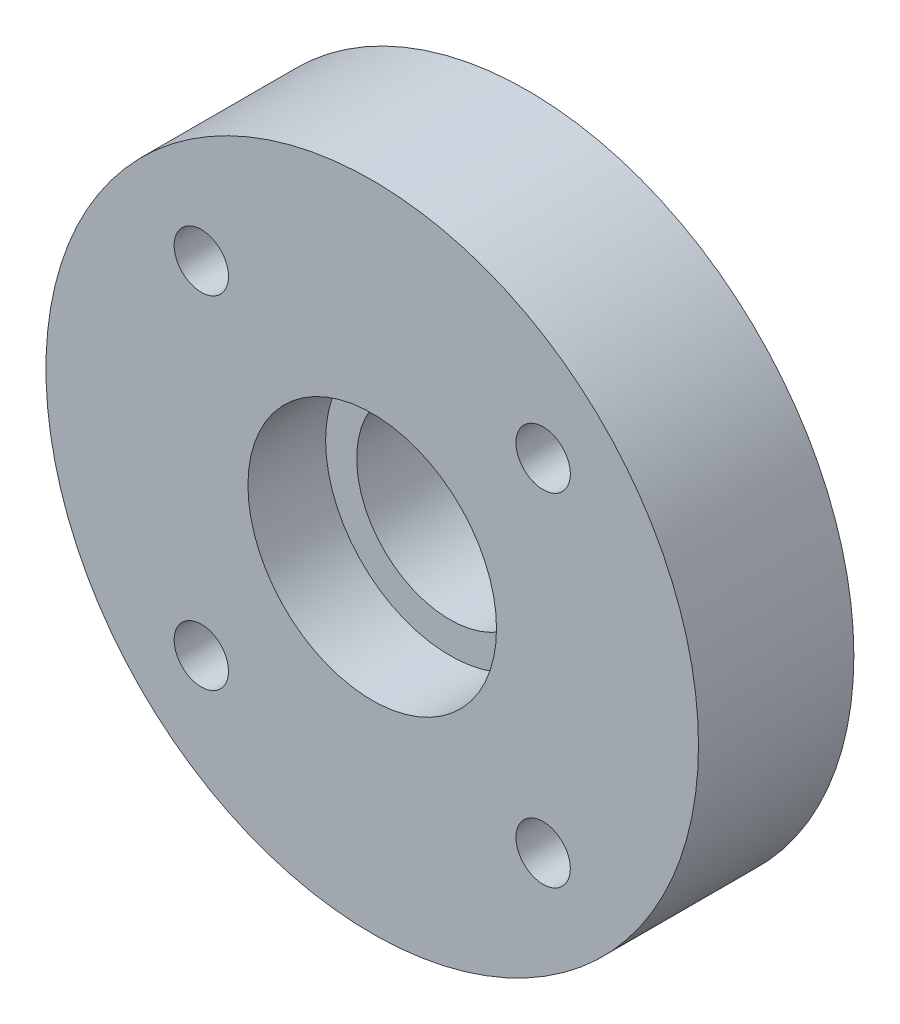
ISO-10303-21;
HEADER;
FILE_DESCRIPTION(('STEP AP214'),'2;1');
FILE_NAME('part.step','',(''),(''),'','','');
FILE_SCHEMA(('AUTOMOTIVE_DESIGN { 1 0 10303 214 1 1 1 1 }'));
ENDSEC;
DATA;
#1=APPLICATION_CONTEXT('core data for automotive mechanical design processes');
#2=APPLICATION_PROTOCOL_DEFINITION('international standard','automotive_design',2000,#1);
#3=PRODUCT_CONTEXT('',#1,'mechanical');
#4=PRODUCT('Part','Part','',(#3));
#5=PRODUCT_RELATED_PRODUCT_CATEGORY('part','',(#4));
#6=PRODUCT_DEFINITION_FORMATION('','',#4);
#7=PRODUCT_DEFINITION_CONTEXT('part definition',#1,'design');
#8=PRODUCT_DEFINITION('design','',#6,#7);
#9=PRODUCT_DEFINITION_SHAPE('','',#8);
#10=(LENGTH_UNIT() NAMED_UNIT(*) SI_UNIT(.MILLI.,.METRE.));
#11=(NAMED_UNIT(*) PLANE_ANGLE_UNIT() SI_UNIT($,.RADIAN.));
#12=(NAMED_UNIT(*) SI_UNIT($,.STERADIAN.) SOLID_ANGLE_UNIT());
#13=UNCERTAINTY_MEASURE_WITH_UNIT(LENGTH_MEASURE(1.E-05),#10,'distance_accuracy_value','');
#14=(GEOMETRIC_REPRESENTATION_CONTEXT(3) GLOBAL_UNCERTAINTY_ASSIGNED_CONTEXT((#13)) GLOBAL_UNIT_ASSIGNED_CONTEXT((#10,
#11,#12)) REPRESENTATION_CONTEXT('',''));
#15=CARTESIAN_POINT('',(0.,0.,0.));
#16=DIRECTION('',(0.,0.,1.));
#17=DIRECTION('',(1.,0.,0.));
#18=AXIS2_PLACEMENT_3D('',#15,#16,#17);
#19=CARTESIAN_POINT('',(0.,0.,0.));
#20=DIRECTION('',(0.,0.,1.));
#21=DIRECTION('',(1.,0.,0.));
#22=AXIS2_PLACEMENT_3D('',#19,#20,#21);
#23=CYLINDRICAL_SURFACE('',#22,6.);
#24=CARTESIAN_POINT('',(0.,0.,0.));
#25=DIRECTION('',(0.,0.,1.));
#26=DIRECTION('',(1.,0.,0.));
#27=AXIS2_PLACEMENT_3D('',#24,#25,#26);
#28=CIRCLE('',#27,6.);
#29=CARTESIAN_POINT('',(6.,0.,0.));
#30=VERTEX_POINT('',#29);
#31=EDGE_CURVE('E44',#30,#30,#28,.T.);
#32=ORIENTED_EDGE('',*,*,#31,.F.);
#33=EDGE_LOOP('',(#32));
#34=FACE_BOUND('',#33,.T.);
#35=CARTESIAN_POINT('',(0.,0.,5.));
#36=DIRECTION('',(0.,0.,1.));
#37=DIRECTION('',(1.,0.,0.));
#38=AXIS2_PLACEMENT_3D('',#35,#36,#37);
#39=CIRCLE('',#38,6.);
#40=CARTESIAN_POINT('',(6.,0.,5.));
#41=VERTEX_POINT('',#40);
#42=EDGE_CURVE('E35',#41,#41,#39,.F.);
#43=ORIENTED_EDGE('',*,*,#42,.F.);
#44=EDGE_LOOP('',(#43));
#45=FACE_BOUND('',#44,.T.);
#46=ADVANCED_FACE('F31',(#34,#45),#23,.F.);
#47=CARTESIAN_POINT('',(0.,0.,10.));
#48=DIRECTION('',(0.,0.,-1.));
#49=DIRECTION('',(-1.,0.,0.));
#50=AXIS2_PLACEMENT_3D('',#47,#48,#49);
#51=CYLINDRICAL_SURFACE('',#50,21.);
#52=CARTESIAN_POINT('',(0.,0.,10.));
#53=DIRECTION('',(0.,0.,1.));
#54=DIRECTION('',(1.,0.,0.));
#55=AXIS2_PLACEMENT_3D('',#52,#53,#54);
#56=CIRCLE('',#55,21.);
#57=CARTESIAN_POINT('',(21.,0.,10.));
#58=VERTEX_POINT('',#57);
#59=EDGE_CURVE('E10',#58,#58,#56,.T.);
#60=ORIENTED_EDGE('',*,*,#59,.F.);
#61=EDGE_LOOP('',(#60));
#62=FACE_BOUND('',#61,.T.);
#63=CARTESIAN_POINT('',(0.,0.,0.));
#64=DIRECTION('',(0.,0.,1.));
#65=DIRECTION('',(1.,0.,0.));
#66=AXIS2_PLACEMENT_3D('',#63,#64,#65);
#67=CIRCLE('',#66,21.);
#68=CARTESIAN_POINT('',(21.,0.,0.));
#69=VERTEX_POINT('',#68);
#70=EDGE_CURVE('E39',#69,#69,#67,.T.);
#71=ORIENTED_EDGE('',*,*,#70,.T.);
#72=EDGE_LOOP('',(#71));
#73=FACE_BOUND('',#72,.T.);
#74=ADVANCED_FACE('F33',(#62,#73),#51,.T.);
#75=CARTESIAN_POINT('',(0.,0.,10.));
#76=DIRECTION('',(0.,0.,1.));
#77=DIRECTION('',(1.,0.,0.));
#78=AXIS2_PLACEMENT_3D('',#75,#76,#77);
#79=PLANE('',#78);
#80=CARTESIAN_POINT('',(-11.,-11.,10.));
#81=DIRECTION('',(0.,0.,1.));
#82=DIRECTION('',(-1.,0.,0.));
#83=AXIS2_PLACEMENT_3D('',#80,#81,#82);
#84=CIRCLE('',#83,1.75);
#85=CARTESIAN_POINT('',(-12.75,-11.,10.));
#86=VERTEX_POINT('',#85);
#87=EDGE_CURVE('E73',#86,#86,#84,.T.);
#88=ORIENTED_EDGE('',*,*,#87,.F.);
#89=EDGE_LOOP('',(#88));
#90=FACE_BOUND('',#89,.T.);
#91=CARTESIAN_POINT('',(11.,-11.,10.));
#92=DIRECTION('',(0.,0.,1.));
#93=DIRECTION('',(1.,0.,0.));
#94=AXIS2_PLACEMENT_3D('',#91,#92,#93);
#95=CIRCLE('',#94,1.75);
#96=CARTESIAN_POINT('',(12.75,-11.,10.));
#97=VERTEX_POINT('',#96);
#98=EDGE_CURVE('E67',#97,#97,#95,.T.);
#99=ORIENTED_EDGE('',*,*,#98,.F.);
#100=EDGE_LOOP('',(#99));
#101=FACE_BOUND('',#100,.T.);
#102=CARTESIAN_POINT('',(11.,11.,10.));
#103=DIRECTION('',(0.,0.,1.));
#104=DIRECTION('',(-1.,0.,0.));
#105=AXIS2_PLACEMENT_3D('',#102,#103,#104);
#106=CIRCLE('',#105,1.75);
#107=CARTESIAN_POINT('',(9.25,11.,10.));
#108=VERTEX_POINT('',#107);
#109=EDGE_CURVE('E61',#108,#108,#106,.T.);
#110=ORIENTED_EDGE('',*,*,#109,.F.);
#111=EDGE_LOOP('',(#110));
#112=FACE_BOUND('',#111,.T.);
#113=CARTESIAN_POINT('',(-11.,11.,10.));
#114=DIRECTION('',(0.,0.,1.));
#115=DIRECTION('',(1.,0.,0.));
#116=AXIS2_PLACEMENT_3D('',#113,#114,#115);
#117=CIRCLE('',#116,1.75);
#118=CARTESIAN_POINT('',(-9.25,11.,10.));
#119=VERTEX_POINT('',#118);
#120=EDGE_CURVE('E55',#119,#119,#117,.T.);
#121=ORIENTED_EDGE('',*,*,#120,.F.);
#122=EDGE_LOOP('',(#121));
#123=FACE_BOUND('',#122,.T.);
#124=CARTESIAN_POINT('',(0.,0.,10.));
#125=DIRECTION('',(0.,0.,1.));
#126=DIRECTION('',(1.,0.,0.));
#127=AXIS2_PLACEMENT_3D('',#124,#125,#126);
#128=CIRCLE('',#127,8.);
#129=CARTESIAN_POINT('',(8.,0.,10.));
#130=VERTEX_POINT('',#129);
#131=EDGE_CURVE('E48',#130,#130,#128,.T.);
#132=ORIENTED_EDGE('',*,*,#131,.F.);
#133=EDGE_LOOP('',(#132));
#134=FACE_BOUND('',#133,.T.);
#135=ORIENTED_EDGE('',*,*,#59,.T.);
#136=EDGE_LOOP('',(#135));
#137=FACE_BOUND('',#136,.T.);
#138=ADVANCED_FACE('F89',(#90,#101,#112,#123,#134,#137),#79,.T.);
#139=CARTESIAN_POINT('',(0.,0.,0.));
#140=DIRECTION('',(0.,0.,1.));
#141=DIRECTION('',(1.,0.,0.));
#142=AXIS2_PLACEMENT_3D('',#139,#140,#141);
#143=PLANE('',#142);
#144=CARTESIAN_POINT('',(-11.,-11.,0.));
#145=DIRECTION('',(0.,0.,1.));
#146=DIRECTION('',(-1.,0.,0.));
#147=AXIS2_PLACEMENT_3D('',#144,#145,#146);
#148=CIRCLE('',#147,1.75);
#149=CARTESIAN_POINT('',(-12.75,-11.,0.));
#150=VERTEX_POINT('',#149);
#151=EDGE_CURVE('E70',#150,#150,#148,.T.);
#152=ORIENTED_EDGE('',*,*,#151,.T.);
#153=EDGE_LOOP('',(#152));
#154=FACE_BOUND('',#153,.T.);
#155=CARTESIAN_POINT('',(11.,-11.,0.));
#156=DIRECTION('',(0.,0.,1.));
#157=DIRECTION('',(1.,0.,0.));
#158=AXIS2_PLACEMENT_3D('',#155,#156,#157);
#159=CIRCLE('',#158,1.75);
#160=CARTESIAN_POINT('',(12.75,-11.,0.));
#161=VERTEX_POINT('',#160);
#162=EDGE_CURVE('E64',#161,#161,#159,.T.);
#163=ORIENTED_EDGE('',*,*,#162,.T.);
#164=EDGE_LOOP('',(#163));
#165=FACE_BOUND('',#164,.T.);
#166=CARTESIAN_POINT('',(11.,11.,0.));
#167=DIRECTION('',(0.,0.,1.));
#168=DIRECTION('',(-1.,0.,0.));
#169=AXIS2_PLACEMENT_3D('',#166,#167,#168);
#170=CIRCLE('',#169,1.75);
#171=CARTESIAN_POINT('',(9.25,11.,0.));
#172=VERTEX_POINT('',#171);
#173=EDGE_CURVE('E58',#172,#172,#170,.T.);
#174=ORIENTED_EDGE('',*,*,#173,.T.);
#175=EDGE_LOOP('',(#174));
#176=FACE_BOUND('',#175,.T.);
#177=CARTESIAN_POINT('',(-11.,11.,0.));
#178=DIRECTION('',(0.,0.,1.));
#179=DIRECTION('',(1.,0.,0.));
#180=AXIS2_PLACEMENT_3D('',#177,#178,#179);
#181=CIRCLE('',#180,1.75);
#182=CARTESIAN_POINT('',(-9.25,11.,0.));
#183=VERTEX_POINT('',#182);
#184=EDGE_CURVE('E52',#183,#183,#181,.T.);
#185=ORIENTED_EDGE('',*,*,#184,.T.);
#186=EDGE_LOOP('',(#185));
#187=FACE_BOUND('',#186,.T.);
#188=ORIENTED_EDGE('',*,*,#31,.T.);
#189=EDGE_LOOP('',(#188));
#190=FACE_BOUND('',#189,.T.);
#191=ORIENTED_EDGE('',*,*,#70,.F.);
#192=EDGE_LOOP('',(#191));
#193=FACE_BOUND('',#192,.T.);
#194=ADVANCED_FACE('F79',(#154,#165,#176,#187,#190,#193),#143,.F.);
#195=CARTESIAN_POINT('',(0.,0.,5.));
#196=DIRECTION('',(0.,0.,1.));
#197=DIRECTION('',(1.,0.,0.));
#198=AXIS2_PLACEMENT_3D('',#195,#196,#197);
#199=PLANE('',#198);
#200=CARTESIAN_POINT('',(0.,0.,5.));
#201=DIRECTION('',(0.,0.,1.));
#202=DIRECTION('',(1.,0.,0.));
#203=AXIS2_PLACEMENT_3D('',#200,#201,#202);
#204=CIRCLE('',#203,8.);
#205=CARTESIAN_POINT('',(8.,0.,5.));
#206=VERTEX_POINT('',#205);
#207=EDGE_CURVE('E51',#206,#206,#204,.T.);
#208=ORIENTED_EDGE('',*,*,#207,.T.);
#209=EDGE_LOOP('',(#208));
#210=FACE_BOUND('',#209,.T.);
#211=ORIENTED_EDGE('',*,*,#42,.T.);
#212=EDGE_LOOP('',(#211));
#213=FACE_BOUND('',#212,.T.);
#214=ADVANCED_FACE('F104',(#210,#213),#199,.T.);
#215=CARTESIAN_POINT('',(0.,0.,5.));
#216=DIRECTION('',(0.,0.,1.));
#217=DIRECTION('',(1.,0.,0.));
#218=AXIS2_PLACEMENT_3D('',#215,#216,#217);
#219=CYLINDRICAL_SURFACE('',#218,8.);
#220=ORIENTED_EDGE('',*,*,#207,.F.);
#221=EDGE_LOOP('',(#220));
#222=FACE_BOUND('',#221,.T.);
#223=ORIENTED_EDGE('',*,*,#131,.T.);
#224=EDGE_LOOP('',(#223));
#225=FACE_BOUND('',#224,.T.);
#226=ADVANCED_FACE('F101',(#222,#225),#219,.F.);
#227=CARTESIAN_POINT('',(-11.,11.,0.));
#228=DIRECTION('',(0.,0.,1.));
#229=DIRECTION('',(1.,0.,0.));
#230=AXIS2_PLACEMENT_3D('',#227,#228,#229);
#231=CYLINDRICAL_SURFACE('',#230,1.75);
#232=ORIENTED_EDGE('',*,*,#184,.F.);
#233=EDGE_LOOP('',(#232));
#234=FACE_BOUND('',#233,.T.);
#235=ORIENTED_EDGE('',*,*,#120,.T.);
#236=EDGE_LOOP('',(#235));
#237=FACE_BOUND('',#236,.T.);
#238=ADVANCED_FACE('F103',(#234,#237),#231,.F.);
#239=CARTESIAN_POINT('',(11.,11.,0.));
#240=DIRECTION('',(0.,0.,1.));
#241=DIRECTION('',(1.,0.,0.));
#242=AXIS2_PLACEMENT_3D('',#239,#240,#241);
#243=CYLINDRICAL_SURFACE('',#242,1.75);
#244=ORIENTED_EDGE('',*,*,#173,.F.);
#245=EDGE_LOOP('',(#244));
#246=FACE_BOUND('',#245,.T.);
#247=ORIENTED_EDGE('',*,*,#109,.T.);
#248=EDGE_LOOP('',(#247));
#249=FACE_BOUND('',#248,.T.);
#250=ADVANCED_FACE('F111',(#246,#249),#243,.F.);
#251=CARTESIAN_POINT('',(11.,-11.,0.));
#252=DIRECTION('',(0.,0.,1.));
#253=DIRECTION('',(1.,0.,0.));
#254=AXIS2_PLACEMENT_3D('',#251,#252,#253);
#255=CYLINDRICAL_SURFACE('',#254,1.75);
#256=ORIENTED_EDGE('',*,*,#162,.F.);
#257=EDGE_LOOP('',(#256));
#258=FACE_BOUND('',#257,.T.);
#259=ORIENTED_EDGE('',*,*,#98,.T.);
#260=EDGE_LOOP('',(#259));
#261=FACE_BOUND('',#260,.T.);
#262=ADVANCED_FACE('F85',(#258,#261),#255,.F.);
#263=CARTESIAN_POINT('',(-11.,-11.,0.));
#264=DIRECTION('',(0.,0.,1.));
#265=DIRECTION('',(1.,0.,0.));
#266=AXIS2_PLACEMENT_3D('',#263,#264,#265);
#267=CYLINDRICAL_SURFACE('',#266,1.75);
#268=ORIENTED_EDGE('',*,*,#151,.F.);
#269=EDGE_LOOP('',(#268));
#270=FACE_BOUND('',#269,.T.);
#271=ORIENTED_EDGE('',*,*,#87,.T.);
#272=EDGE_LOOP('',(#271));
#273=FACE_BOUND('',#272,.T.);
#274=ADVANCED_FACE('F82',(#270,#273),#267,.F.);
#275=CLOSED_SHELL('',(#46,#74,#138,#194,#214,#226,#238,#250,#262,#274));
#276=MANIFOLD_SOLID_BREP('B2',#275);
#277=ADVANCED_BREP_SHAPE_REPRESENTATION('',(#18,#276),#14);
#278=SHAPE_DEFINITION_REPRESENTATION(#9,#277);
ENDSEC;
END-ISO-10303-21;
